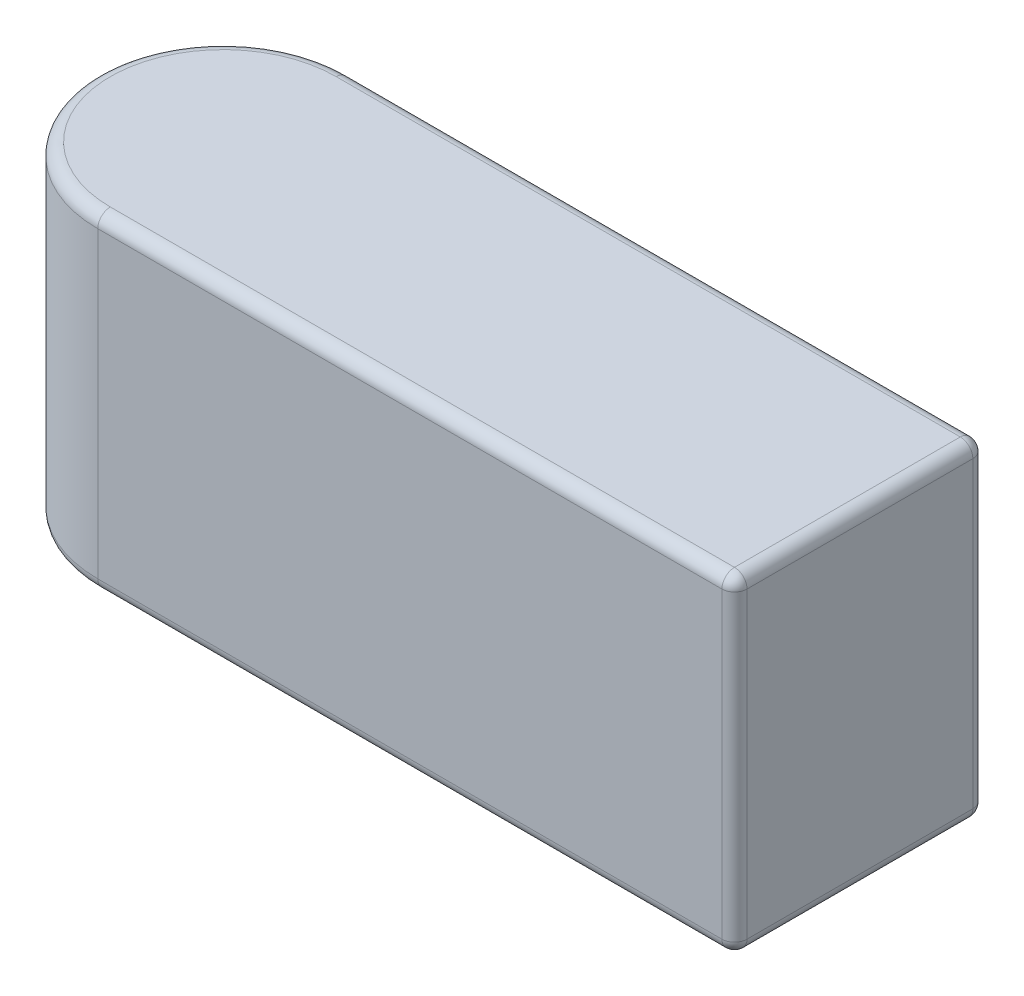
ISO-10303-21;
HEADER;
FILE_DESCRIPTION(('STEP AP214'),'2;1');
FILE_NAME('part.step','',(''),(''),'','','');
FILE_SCHEMA(('AUTOMOTIVE_DESIGN { 1 0 10303 214 1 1 1 1 }'));
ENDSEC;
DATA;
#1=APPLICATION_CONTEXT('core data for automotive mechanical design processes');
#2=APPLICATION_PROTOCOL_DEFINITION('international standard','automotive_design',2000,#1);
#3=PRODUCT_CONTEXT('',#1,'mechanical');
#4=PRODUCT('Part','Part','',(#3));
#5=PRODUCT_RELATED_PRODUCT_CATEGORY('part','',(#4));
#6=PRODUCT_DEFINITION_FORMATION('','',#4);
#7=PRODUCT_DEFINITION_CONTEXT('part definition',#1,'design');
#8=PRODUCT_DEFINITION('design','',#6,#7);
#9=PRODUCT_DEFINITION_SHAPE('','',#8);
#10=(LENGTH_UNIT() NAMED_UNIT(*) SI_UNIT(.MILLI.,.METRE.));
#11=(NAMED_UNIT(*) PLANE_ANGLE_UNIT() SI_UNIT($,.RADIAN.));
#12=(NAMED_UNIT(*) SI_UNIT($,.STERADIAN.) SOLID_ANGLE_UNIT());
#13=UNCERTAINTY_MEASURE_WITH_UNIT(LENGTH_MEASURE(1.E-05),#10,'distance_accuracy_value','');
#14=(GEOMETRIC_REPRESENTATION_CONTEXT(3) GLOBAL_UNCERTAINTY_ASSIGNED_CONTEXT((#13)) GLOBAL_UNIT_ASSIGNED_CONTEXT((#10,
#11,#12)) REPRESENTATION_CONTEXT('',''));
#15=CARTESIAN_POINT('',(0.,0.,0.));
#16=DIRECTION('',(0.,0.,1.));
#17=DIRECTION('',(1.,0.,0.));
#18=AXIS2_PLACEMENT_3D('',#15,#16,#17);
#19=CARTESIAN_POINT('',(-38.57625,16.61795,25.4));
#20=DIRECTION('',(0.,-1.,0.));
#21=DIRECTION('',(0.,0.,-1.));
#22=AXIS2_PLACEMENT_3D('',#19,#20,#21);
#23=PLANE('',#22);
#24=DIRECTION('',(-1.,0.,0.));
#25=VECTOR('',#24,1.);
#26=CARTESIAN_POINT('',(-38.57625,16.61795,24.13));
#27=LINE('',#26,#25);
#28=CARTESIAN_POINT('',(-25.87625,16.61795,24.13));
#29=VERTEX_POINT('',#28);
#30=CARTESIAN_POINT('',(37.30625,16.61795,24.13));
#31=VERTEX_POINT('',#30);
#32=EDGE_CURVE('E50',#29,#31,#27,.F.);
#33=ORIENTED_EDGE('',*,*,#32,.T.);
#34=DIRECTION('',(0.,0.,-1.));
#35=VECTOR('',#34,1.);
#36=CARTESIAN_POINT('',(37.30625,16.61795,25.4));
#37=LINE('',#36,#35);
#38=CARTESIAN_POINT('',(37.30625,16.61795,1.27));
#39=VERTEX_POINT('',#38);
#40=EDGE_CURVE('E11',#31,#39,#37,.T.);
#41=ORIENTED_EDGE('',*,*,#40,.T.);
#42=DIRECTION('',(-1.,0.,0.));
#43=VECTOR('',#42,1.);
#44=CARTESIAN_POINT('',(-25.87625,16.61795,1.27));
#45=LINE('',#44,#43);
#46=CARTESIAN_POINT('',(-25.87625,16.61795,1.27));
#47=VERTEX_POINT('',#46);
#48=EDGE_CURVE('E130',#39,#47,#45,.T.);
#49=ORIENTED_EDGE('',*,*,#48,.T.);
#50=CARTESIAN_POINT('',(-25.87625,16.61795,12.7));
#51=DIRECTION('',(0.,-1.,0.));
#52=DIRECTION('',(0.,0.,-1.));
#53=AXIS2_PLACEMENT_3D('',#50,#51,#52);
#54=CIRCLE('',#53,11.43);
#55=EDGE_CURVE('E61',#47,#29,#54,.F.);
#56=ORIENTED_EDGE('',*,*,#55,.T.);
#57=EDGE_LOOP('',(#33,#41,#49,#56));
#58=FACE_BOUND('',#57,.T.);
#59=ADVANCED_FACE('F41',(#58),#23,.F.);
#60=CARTESIAN_POINT('',(-38.57625,-16.61795,25.4));
#61=DIRECTION('',(0.,1.,0.));
#62=DIRECTION('',(0.,0.,1.));
#63=AXIS2_PLACEMENT_3D('',#60,#61,#62);
#64=PLANE('',#63);
#65=DIRECTION('',(1.,0.,0.));
#66=VECTOR('',#65,1.);
#67=CARTESIAN_POINT('',(38.57625,-16.61795,1.27));
#68=LINE('',#67,#66);
#69=CARTESIAN_POINT('',(-25.87625,-16.61795,1.27));
#70=VERTEX_POINT('',#69);
#71=CARTESIAN_POINT('',(37.30625,-16.61795,1.27));
#72=VERTEX_POINT('',#71);
#73=EDGE_CURVE('E178',#70,#72,#68,.T.);
#74=ORIENTED_EDGE('',*,*,#73,.T.);
#75=DIRECTION('',(0.,0.,-1.));
#76=VECTOR('',#75,1.);
#77=CARTESIAN_POINT('',(37.30625,-16.61795,25.4));
#78=LINE('',#77,#76);
#79=CARTESIAN_POINT('',(37.30625,-16.61795,24.13));
#80=VERTEX_POINT('',#79);
#81=EDGE_CURVE('E180',#72,#80,#78,.F.);
#82=ORIENTED_EDGE('',*,*,#81,.T.);
#83=DIRECTION('',(1.,0.,0.));
#84=VECTOR('',#83,1.);
#85=CARTESIAN_POINT('',(-38.57625,-16.61795,24.13));
#86=LINE('',#85,#84);
#87=CARTESIAN_POINT('',(-25.87625,-16.61795,24.13));
#88=VERTEX_POINT('',#87);
#89=EDGE_CURVE('E175',#80,#88,#86,.F.);
#90=ORIENTED_EDGE('',*,*,#89,.T.);
#91=CARTESIAN_POINT('',(-25.87625,-16.61795,12.7));
#92=DIRECTION('',(0.,1.,0.));
#93=DIRECTION('',(0.,0.,1.));
#94=AXIS2_PLACEMENT_3D('',#91,#92,#93);
#95=CIRCLE('',#94,11.43);
#96=EDGE_CURVE('E146',#88,#70,#95,.F.);
#97=ORIENTED_EDGE('',*,*,#96,.T.);
#98=EDGE_LOOP('',(#74,#82,#90,#97));
#99=FACE_BOUND('',#98,.T.);
#100=ADVANCED_FACE('F262',(#99),#64,.F.);
#101=CARTESIAN_POINT('',(38.57625,-16.61795,25.4));
#102=DIRECTION('',(-1.,0.,0.));
#103=DIRECTION('',(0.,0.,1.));
#104=AXIS2_PLACEMENT_3D('',#101,#102,#103);
#105=PLANE('',#104);
#106=DIRECTION('',(0.,1.,0.));
#107=VECTOR('',#106,1.);
#108=CARTESIAN_POINT('',(38.57625,-16.61795,24.13));
#109=LINE('',#108,#107);
#110=CARTESIAN_POINT('',(38.57625,15.34795,24.13));
#111=VERTEX_POINT('',#110);
#112=CARTESIAN_POINT('',(38.57625,-15.34795,24.13));
#113=VERTEX_POINT('',#112);
#114=EDGE_CURVE('E164',#111,#113,#109,.F.);
#115=ORIENTED_EDGE('',*,*,#114,.T.);
#116=DIRECTION('',(0.,0.,-1.));
#117=VECTOR('',#116,1.);
#118=CARTESIAN_POINT('',(38.57625,-15.34795,25.4));
#119=LINE('',#118,#117);
#120=CARTESIAN_POINT('',(38.57625,-15.34795,1.27));
#121=VERTEX_POINT('',#120);
#122=EDGE_CURVE('E167',#113,#121,#119,.T.);
#123=ORIENTED_EDGE('',*,*,#122,.T.);
#124=DIRECTION('',(0.,1.,0.));
#125=VECTOR('',#124,1.);
#126=CARTESIAN_POINT('',(38.57625,16.61795,1.27));
#127=LINE('',#126,#125);
#128=CARTESIAN_POINT('',(38.57625,15.34795,1.27));
#129=VERTEX_POINT('',#128);
#130=EDGE_CURVE('E158',#121,#129,#127,.T.);
#131=ORIENTED_EDGE('',*,*,#130,.T.);
#132=DIRECTION('',(0.,0.,-1.));
#133=VECTOR('',#132,1.);
#134=CARTESIAN_POINT('',(38.57625,15.34795,25.4));
#135=LINE('',#134,#133);
#136=EDGE_CURVE('E155',#129,#111,#135,.F.);
#137=ORIENTED_EDGE('',*,*,#136,.T.);
#138=EDGE_LOOP('',(#115,#123,#131,#137));
#139=FACE_BOUND('',#138,.T.);
#140=ADVANCED_FACE('F252',(#139),#105,.F.);
#141=CARTESIAN_POINT('',(0.,0.,25.4));
#142=DIRECTION('',(0.,0.,-1.));
#143=DIRECTION('',(-1.,0.,0.));
#144=AXIS2_PLACEMENT_3D('',#141,#142,#143);
#145=PLANE('',#144);
#146=DIRECTION('',(0.,1.,0.));
#147=VECTOR('',#146,1.);
#148=CARTESIAN_POINT('',(-25.87625,-16.61795,25.4));
#149=LINE('',#148,#147);
#150=CARTESIAN_POINT('',(-25.87625,-15.34795,25.4));
#151=VERTEX_POINT('',#150);
#152=CARTESIAN_POINT('',(-25.87625,15.34795,25.4));
#153=VERTEX_POINT('',#152);
#154=EDGE_CURVE('E122',#151,#153,#149,.T.);
#155=ORIENTED_EDGE('',*,*,#154,.F.);
#156=DIRECTION('',(1.,0.,0.));
#157=VECTOR('',#156,1.);
#158=CARTESIAN_POINT('',(0.,-15.34795,25.4));
#159=LINE('',#158,#157);
#160=CARTESIAN_POINT('',(37.30625,-15.34795,25.4));
#161=VERTEX_POINT('',#160);
#162=EDGE_CURVE('E137',#151,#161,#159,.T.);
#163=ORIENTED_EDGE('',*,*,#162,.T.);
#164=DIRECTION('',(0.,1.,0.));
#165=VECTOR('',#164,1.);
#166=CARTESIAN_POINT('',(37.30625,0.,25.4));
#167=LINE('',#166,#165);
#168=CARTESIAN_POINT('',(37.30625,15.34795,25.4));
#169=VERTEX_POINT('',#168);
#170=EDGE_CURVE('E156',#161,#169,#167,.T.);
#171=ORIENTED_EDGE('',*,*,#170,.T.);
#172=DIRECTION('',(-1.,0.,0.));
#173=VECTOR('',#172,1.);
#174=CARTESIAN_POINT('',(0.,15.34795,25.4));
#175=LINE('',#174,#173);
#176=EDGE_CURVE('E140',#169,#153,#175,.T.);
#177=ORIENTED_EDGE('',*,*,#176,.T.);
#178=EDGE_LOOP('',(#155,#163,#171,#177));
#179=FACE_BOUND('',#178,.T.);
#180=ADVANCED_FACE('F134',(#179),#145,.F.);
#181=CARTESIAN_POINT('',(0.,0.,0.));
#182=DIRECTION('',(0.,0.,-1.));
#183=DIRECTION('',(-1.,0.,0.));
#184=AXIS2_PLACEMENT_3D('',#181,#182,#183);
#185=PLANE('',#184);
#186=DIRECTION('',(0.,1.,0.));
#187=VECTOR('',#186,1.);
#188=CARTESIAN_POINT('',(37.30625,-16.61795,0.));
#189=LINE('',#188,#187);
#190=CARTESIAN_POINT('',(37.30625,15.34795,0.));
#191=VERTEX_POINT('',#190);
#192=CARTESIAN_POINT('',(37.30625,-15.34795,0.));
#193=VERTEX_POINT('',#192);
#194=EDGE_CURVE('E171',#191,#193,#189,.F.);
#195=ORIENTED_EDGE('',*,*,#194,.T.);
#196=DIRECTION('',(1.,0.,0.));
#197=VECTOR('',#196,1.);
#198=CARTESIAN_POINT('',(-25.87625,-15.34795,0.));
#199=LINE('',#198,#197);
#200=CARTESIAN_POINT('',(-25.87625,-15.34795,0.));
#201=VERTEX_POINT('',#200);
#202=EDGE_CURVE('E173',#193,#201,#199,.F.);
#203=ORIENTED_EDGE('',*,*,#202,.T.);
#204=DIRECTION('',(0.,1.,0.));
#205=VECTOR('',#204,1.);
#206=CARTESIAN_POINT('',(-25.87625,-16.61795,0.));
#207=LINE('',#206,#205);
#208=CARTESIAN_POINT('',(-25.87625,15.34795,0.));
#209=VERTEX_POINT('',#208);
#210=EDGE_CURVE('E125',#201,#209,#207,.T.);
#211=ORIENTED_EDGE('',*,*,#210,.T.);
#212=DIRECTION('',(-1.,0.,0.));
#213=VECTOR('',#212,1.);
#214=CARTESIAN_POINT('',(38.57625,15.34795,0.));
#215=LINE('',#214,#213);
#216=EDGE_CURVE('E169',#209,#191,#215,.F.);
#217=ORIENTED_EDGE('',*,*,#216,.T.);
#218=EDGE_LOOP('',(#195,#203,#211,#217));
#219=FACE_BOUND('',#218,.T.);
#220=ADVANCED_FACE('F227',(#219),#185,.T.);
#221=CARTESIAN_POINT('',(-25.87625,-16.61795,12.7));
#222=DIRECTION('',(0.,1.,0.));
#223=DIRECTION('',(0.,0.,1.));
#224=AXIS2_PLACEMENT_3D('',#221,#222,#223);
#225=CYLINDRICAL_SURFACE('',#224,12.7);
#226=ORIENTED_EDGE('',*,*,#210,.F.);
#227=CARTESIAN_POINT('',(-25.87625,-15.34795,12.7));
#228=DIRECTION('',(0.,1.,0.));
#229=DIRECTION('',(0.,0.,1.));
#230=AXIS2_PLACEMENT_3D('',#227,#228,#229);
#231=CIRCLE('',#230,12.7);
#232=EDGE_CURVE('E119',#201,#151,#231,.T.);
#233=ORIENTED_EDGE('',*,*,#232,.T.);
#234=ORIENTED_EDGE('',*,*,#154,.T.);
#235=CARTESIAN_POINT('',(-25.87625,15.34795,12.7));
#236=DIRECTION('',(0.,-1.,0.));
#237=DIRECTION('',(0.,0.,-1.));
#238=AXIS2_PLACEMENT_3D('',#235,#236,#237);
#239=CIRCLE('',#238,12.7);
#240=EDGE_CURVE('E131',#153,#209,#239,.T.);
#241=ORIENTED_EDGE('',*,*,#240,.T.);
#242=EDGE_LOOP('',(#226,#233,#234,#241));
#243=FACE_BOUND('',#242,.T.);
#244=ADVANCED_FACE('F121',(#243),#225,.T.);
#245=CARTESIAN_POINT('',(-38.57625,-15.34795,1.27));
#246=DIRECTION('',(-1.,0.,0.));
#247=DIRECTION('',(0.,0.,1.));
#248=AXIS2_PLACEMENT_3D('',#245,#246,#247);
#249=CYLINDRICAL_SURFACE('',#248,1.27);
#250=CARTESIAN_POINT('',(-25.87625,-15.34795,1.27));
#251=DIRECTION('',(-1.,0.,0.));
#252=DIRECTION('',(0.,0.,1.));
#253=AXIS2_PLACEMENT_3D('',#250,#251,#252);
#254=CIRCLE('',#253,1.27);
#255=EDGE_CURVE('E216',#201,#70,#254,.T.);
#256=ORIENTED_EDGE('',*,*,#255,.F.);
#257=ORIENTED_EDGE('',*,*,#202,.F.);
#258=CARTESIAN_POINT('',(37.30625,-15.34795,1.27));
#259=DIRECTION('',(1.,0.,0.));
#260=DIRECTION('',(0.,0.,-1.));
#261=AXIS2_PLACEMENT_3D('',#258,#259,#260);
#262=CIRCLE('',#261,1.27);
#263=EDGE_CURVE('E217',#72,#193,#262,.T.);
#264=ORIENTED_EDGE('',*,*,#263,.F.);
#265=ORIENTED_EDGE('',*,*,#73,.F.);
#266=EDGE_LOOP('',(#256,#257,#264,#265));
#267=FACE_BOUND('',#266,.T.);
#268=ADVANCED_FACE('F43',(#267),#249,.T.);
#269=CARTESIAN_POINT('',(-38.57625,15.34795,1.27));
#270=DIRECTION('',(1.,0.,0.));
#271=DIRECTION('',(0.,0.,-1.));
#272=AXIS2_PLACEMENT_3D('',#269,#270,#271);
#273=CYLINDRICAL_SURFACE('',#272,1.27);
#274=CARTESIAN_POINT('',(37.30625,15.34795,1.27));
#275=DIRECTION('',(1.,0.,0.));
#276=DIRECTION('',(0.,1.,0.));
#277=AXIS2_PLACEMENT_3D('',#274,#275,#276);
#278=CIRCLE('',#277,1.27);
#279=EDGE_CURVE('E210',#191,#39,#278,.T.);
#280=ORIENTED_EDGE('',*,*,#279,.F.);
#281=ORIENTED_EDGE('',*,*,#216,.F.);
#282=CARTESIAN_POINT('',(-25.87625,15.34795,1.27));
#283=DIRECTION('',(-1.,0.,0.));
#284=DIRECTION('',(0.,0.,1.));
#285=AXIS2_PLACEMENT_3D('',#282,#283,#284);
#286=CIRCLE('',#285,1.27);
#287=EDGE_CURVE('E213',#47,#209,#286,.T.);
#288=ORIENTED_EDGE('',*,*,#287,.F.);
#289=ORIENTED_EDGE('',*,*,#48,.F.);
#290=EDGE_LOOP('',(#280,#281,#288,#289));
#291=FACE_BOUND('',#290,.T.);
#292=ADVANCED_FACE('F233',(#291),#273,.T.);
#293=CARTESIAN_POINT('',(37.30625,-16.61795,1.27));
#294=DIRECTION('',(0.,-1.,0.));
#295=DIRECTION('',(0.,0.,-1.));
#296=AXIS2_PLACEMENT_3D('',#293,#294,#295);
#297=CYLINDRICAL_SURFACE('',#296,1.27);
#298=CARTESIAN_POINT('',(37.30625,-15.34795,1.27));
#299=DIRECTION('',(0.,-1.,0.));
#300=DIRECTION('',(0.,0.,-1.));
#301=AXIS2_PLACEMENT_3D('',#298,#299,#300);
#302=CIRCLE('',#301,1.27);
#303=EDGE_CURVE('E45',#193,#121,#302,.T.);
#304=ORIENTED_EDGE('',*,*,#303,.F.);
#305=ORIENTED_EDGE('',*,*,#194,.F.);
#306=CARTESIAN_POINT('',(37.30625,15.34795,1.27));
#307=DIRECTION('',(0.,1.,0.));
#308=DIRECTION('',(0.,0.,1.));
#309=AXIS2_PLACEMENT_3D('',#306,#307,#308);
#310=CIRCLE('',#309,1.27);
#311=EDGE_CURVE('E207',#129,#191,#310,.T.);
#312=ORIENTED_EDGE('',*,*,#311,.F.);
#313=ORIENTED_EDGE('',*,*,#130,.F.);
#314=EDGE_LOOP('',(#304,#305,#312,#313));
#315=FACE_BOUND('',#314,.T.);
#316=ADVANCED_FACE('F258',(#315),#297,.T.);
#317=CARTESIAN_POINT('',(37.30625,-15.34795,1.27));
#318=DIRECTION('',(0.,0.,-1.));
#319=DIRECTION('',(-1.,0.,0.));
#320=AXIS2_PLACEMENT_3D('',#317,#318,#319);
#321=SPHERICAL_SURFACE('',#320,1.27);
#322=ORIENTED_EDGE('',*,*,#263,.T.);
#323=ORIENTED_EDGE('',*,*,#303,.T.);
#324=CARTESIAN_POINT('',(37.30625,-15.34795,1.27));
#325=DIRECTION('',(0.,0.,-1.));
#326=DIRECTION('',(-1.,0.,0.));
#327=AXIS2_PLACEMENT_3D('',#324,#325,#326);
#328=CIRCLE('',#327,1.27);
#329=EDGE_CURVE('E149',#72,#121,#328,.F.);
#330=ORIENTED_EDGE('',*,*,#329,.F.);
#331=EDGE_LOOP('',(#322,#323,#330));
#332=FACE_BOUND('',#331,.T.);
#333=ADVANCED_FACE('F297',(#332),#321,.T.);
#334=CARTESIAN_POINT('',(-25.87625,-15.34795,12.7));
#335=DIRECTION('',(0.,1.,0.));
#336=DIRECTION('',(0.,0.,1.));
#337=AXIS2_PLACEMENT_3D('',#334,#335,#336);
#338=TOROIDAL_SURFACE('',#337,11.43,1.27);
#339=ORIENTED_EDGE('',*,*,#255,.T.);
#340=ORIENTED_EDGE('',*,*,#96,.F.);
#341=CARTESIAN_POINT('',(-25.87625,-15.34795,24.13));
#342=DIRECTION('',(1.,0.,0.));
#343=DIRECTION('',(0.,0.,-1.));
#344=AXIS2_PLACEMENT_3D('',#341,#342,#343);
#345=CIRCLE('',#344,1.27);
#346=EDGE_CURVE('E144',#151,#88,#345,.T.);
#347=ORIENTED_EDGE('',*,*,#346,.F.);
#348=ORIENTED_EDGE('',*,*,#232,.F.);
#349=EDGE_LOOP('',(#339,#340,#347,#348));
#350=FACE_BOUND('',#349,.T.);
#351=ADVANCED_FACE('F145',(#350),#338,.T.);
#352=CARTESIAN_POINT('',(-25.87625,15.34795,12.7));
#353=DIRECTION('',(0.,-1.,0.));
#354=DIRECTION('',(0.,0.,-1.));
#355=AXIS2_PLACEMENT_3D('',#352,#353,#354);
#356=TOROIDAL_SURFACE('',#355,11.43,1.27);
#357=ORIENTED_EDGE('',*,*,#287,.T.);
#358=ORIENTED_EDGE('',*,*,#240,.F.);
#359=CARTESIAN_POINT('',(-25.87625,15.34795,24.13));
#360=DIRECTION('',(1.,0.,0.));
#361=DIRECTION('',(0.,0.,-1.));
#362=AXIS2_PLACEMENT_3D('',#359,#360,#361);
#363=CIRCLE('',#362,1.27);
#364=EDGE_CURVE('E150',#29,#153,#363,.T.);
#365=ORIENTED_EDGE('',*,*,#364,.F.);
#366=ORIENTED_EDGE('',*,*,#55,.F.);
#367=EDGE_LOOP('',(#357,#358,#365,#366));
#368=FACE_BOUND('',#367,.T.);
#369=ADVANCED_FACE('F236',(#368),#356,.T.);
#370=CARTESIAN_POINT('',(37.30625,15.34795,1.27));
#371=DIRECTION('',(0.,0.,-1.));
#372=DIRECTION('',(-1.,0.,0.));
#373=AXIS2_PLACEMENT_3D('',#370,#371,#372);
#374=SPHERICAL_SURFACE('',#373,1.27);
#375=ORIENTED_EDGE('',*,*,#311,.T.);
#376=ORIENTED_EDGE('',*,*,#279,.T.);
#377=CARTESIAN_POINT('',(37.30625,15.34795,1.27));
#378=DIRECTION('',(0.,0.,-1.));
#379=DIRECTION('',(-1.,0.,0.));
#380=AXIS2_PLACEMENT_3D('',#377,#378,#379);
#381=CIRCLE('',#380,1.27);
#382=EDGE_CURVE('E201',#129,#39,#381,.F.);
#383=ORIENTED_EDGE('',*,*,#382,.F.);
#384=EDGE_LOOP('',(#375,#376,#383));
#385=FACE_BOUND('',#384,.T.);
#386=ADVANCED_FACE('F260',(#385),#374,.T.);
#387=CARTESIAN_POINT('',(37.30625,-15.34795,25.4));
#388=DIRECTION('',(0.,0.,-1.));
#389=DIRECTION('',(-1.,0.,0.));
#390=AXIS2_PLACEMENT_3D('',#387,#388,#389);
#391=CYLINDRICAL_SURFACE('',#390,1.27);
#392=ORIENTED_EDGE('',*,*,#329,.T.);
#393=ORIENTED_EDGE('',*,*,#122,.F.);
#394=CARTESIAN_POINT('',(37.30625,-15.34795,24.13));
#395=DIRECTION('',(0.,0.,1.));
#396=DIRECTION('',(1.,0.,0.));
#397=AXIS2_PLACEMENT_3D('',#394,#395,#396);
#398=CIRCLE('',#397,1.27);
#399=EDGE_CURVE('E198',#80,#113,#398,.T.);
#400=ORIENTED_EDGE('',*,*,#399,.F.);
#401=ORIENTED_EDGE('',*,*,#81,.F.);
#402=EDGE_LOOP('',(#392,#393,#400,#401));
#403=FACE_BOUND('',#402,.T.);
#404=ADVANCED_FACE('F287',(#403),#391,.T.);
#405=CARTESIAN_POINT('',(0.,-15.34795,24.13));
#406=DIRECTION('',(1.,0.,0.));
#407=DIRECTION('',(0.,0.,-1.));
#408=AXIS2_PLACEMENT_3D('',#405,#406,#407);
#409=CYLINDRICAL_SURFACE('',#408,1.27);
#410=ORIENTED_EDGE('',*,*,#346,.T.);
#411=ORIENTED_EDGE('',*,*,#89,.F.);
#412=CARTESIAN_POINT('',(37.30625,-15.34795,24.13));
#413=DIRECTION('',(1.,0.,0.));
#414=DIRECTION('',(0.,0.,-1.));
#415=AXIS2_PLACEMENT_3D('',#412,#413,#414);
#416=CIRCLE('',#415,1.27);
#417=EDGE_CURVE('E153',#161,#80,#416,.T.);
#418=ORIENTED_EDGE('',*,*,#417,.F.);
#419=ORIENTED_EDGE('',*,*,#162,.F.);
#420=EDGE_LOOP('',(#410,#411,#418,#419));
#421=FACE_BOUND('',#420,.T.);
#422=ADVANCED_FACE('F152',(#421),#409,.T.);
#423=CARTESIAN_POINT('',(0.,15.34795,24.13));
#424=DIRECTION('',(-1.,0.,0.));
#425=DIRECTION('',(0.,0.,1.));
#426=AXIS2_PLACEMENT_3D('',#423,#424,#425);
#427=CYLINDRICAL_SURFACE('',#426,1.27);
#428=ORIENTED_EDGE('',*,*,#364,.T.);
#429=ORIENTED_EDGE('',*,*,#176,.F.);
#430=CARTESIAN_POINT('',(37.30625,15.34795,24.13));
#431=DIRECTION('',(1.,0.,0.));
#432=DIRECTION('',(0.,0.,-1.));
#433=AXIS2_PLACEMENT_3D('',#430,#431,#432);
#434=CIRCLE('',#433,1.27);
#435=EDGE_CURVE('E194',#31,#169,#434,.T.);
#436=ORIENTED_EDGE('',*,*,#435,.F.);
#437=ORIENTED_EDGE('',*,*,#32,.F.);
#438=EDGE_LOOP('',(#428,#429,#436,#437));
#439=FACE_BOUND('',#438,.T.);
#440=ADVANCED_FACE('F239',(#439),#427,.T.);
#441=CARTESIAN_POINT('',(37.30625,15.34795,25.4));
#442=DIRECTION('',(0.,0.,-1.));
#443=DIRECTION('',(-1.,0.,0.));
#444=AXIS2_PLACEMENT_3D('',#441,#442,#443);
#445=CYLINDRICAL_SURFACE('',#444,1.27);
#446=ORIENTED_EDGE('',*,*,#382,.T.);
#447=ORIENTED_EDGE('',*,*,#40,.F.);
#448=CARTESIAN_POINT('',(37.30625,15.34795,24.13));
#449=DIRECTION('',(0.,0.,1.));
#450=DIRECTION('',(1.,0.,0.));
#451=AXIS2_PLACEMENT_3D('',#448,#449,#450);
#452=CIRCLE('',#451,1.27);
#453=EDGE_CURVE('E191',#111,#31,#452,.T.);
#454=ORIENTED_EDGE('',*,*,#453,.F.);
#455=ORIENTED_EDGE('',*,*,#136,.F.);
#456=EDGE_LOOP('',(#446,#447,#454,#455));
#457=FACE_BOUND('',#456,.T.);
#458=ADVANCED_FACE('F247',(#457),#445,.T.);
#459=CARTESIAN_POINT('',(37.30625,-15.34795,24.13));
#460=DIRECTION('',(0.,-1.,0.));
#461=DIRECTION('',(0.,0.,-1.));
#462=AXIS2_PLACEMENT_3D('',#459,#460,#461);
#463=SPHERICAL_SURFACE('',#462,1.27);
#464=ORIENTED_EDGE('',*,*,#417,.T.);
#465=ORIENTED_EDGE('',*,*,#399,.T.);
#466=CARTESIAN_POINT('',(37.30625,-15.34795,24.13));
#467=DIRECTION('',(0.,-1.,0.));
#468=DIRECTION('',(0.,0.,-1.));
#469=AXIS2_PLACEMENT_3D('',#466,#467,#468);
#470=CIRCLE('',#469,1.27);
#471=EDGE_CURVE('E189',#161,#113,#470,.F.);
#472=ORIENTED_EDGE('',*,*,#471,.F.);
#473=EDGE_LOOP('',(#464,#465,#472));
#474=FACE_BOUND('',#473,.T.);
#475=ADVANCED_FACE('F277',(#474),#463,.T.);
#476=CARTESIAN_POINT('',(37.30625,15.34795,24.13));
#477=DIRECTION('',(0.,1.,0.));
#478=DIRECTION('',(-1.,0.,0.));
#479=AXIS2_PLACEMENT_3D('',#476,#477,#478);
#480=SPHERICAL_SURFACE('',#479,1.27);
#481=ORIENTED_EDGE('',*,*,#453,.T.);
#482=ORIENTED_EDGE('',*,*,#435,.T.);
#483=CARTESIAN_POINT('',(37.30625,15.34795,24.13));
#484=DIRECTION('',(0.,1.,0.));
#485=DIRECTION('',(0.,0.,1.));
#486=AXIS2_PLACEMENT_3D('',#483,#484,#485);
#487=CIRCLE('',#486,1.27);
#488=EDGE_CURVE('E187',#111,#169,#487,.F.);
#489=ORIENTED_EDGE('',*,*,#488,.F.);
#490=EDGE_LOOP('',(#481,#482,#489));
#491=FACE_BOUND('',#490,.T.);
#492=ADVANCED_FACE('F243',(#491),#480,.T.);
#493=CARTESIAN_POINT('',(37.30625,0.,24.13));
#494=DIRECTION('',(0.,1.,0.));
#495=DIRECTION('',(0.,0.,1.));
#496=AXIS2_PLACEMENT_3D('',#493,#494,#495);
#497=CYLINDRICAL_SURFACE('',#496,1.27);
#498=ORIENTED_EDGE('',*,*,#471,.T.);
#499=ORIENTED_EDGE('',*,*,#114,.F.);
#500=ORIENTED_EDGE('',*,*,#488,.T.);
#501=ORIENTED_EDGE('',*,*,#170,.F.);
#502=EDGE_LOOP('',(#498,#499,#500,#501));
#503=FACE_BOUND('',#502,.T.);
#504=ADVANCED_FACE('F249',(#503),#497,.T.);
#505=CLOSED_SHELL('',(#59,#100,#140,#180,#220,#244,#268,#292,#316,#333,#351,#369,#386,#404,#422,
#440,#458,#475,#492,#504));
#506=MANIFOLD_SOLID_BREP('B2',#505);
#507=ADVANCED_BREP_SHAPE_REPRESENTATION('',(#18,#506),#14);
#508=SHAPE_DEFINITION_REPRESENTATION(#9,#507);
ENDSEC;
END-ISO-10303-21;
